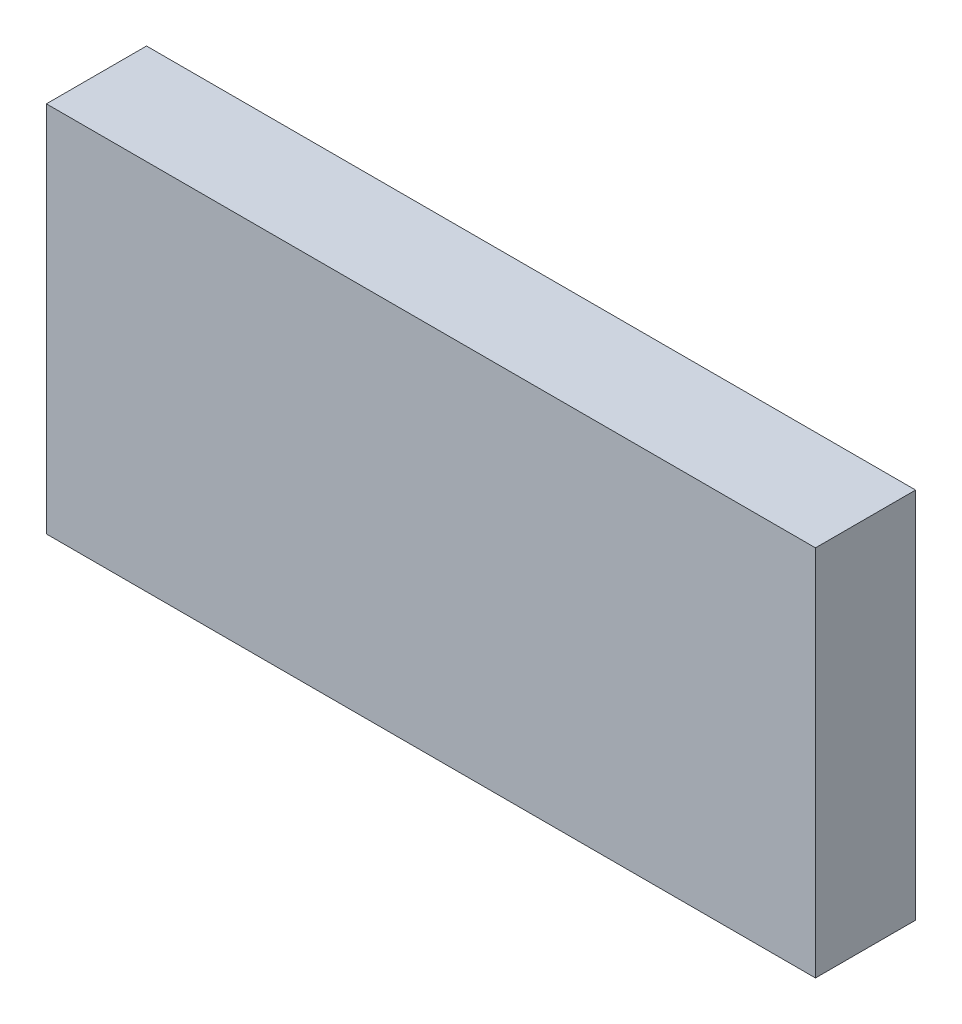
ISO-10303-21;
HEADER;
FILE_DESCRIPTION(('STEP AP214'),'2;1');
FILE_NAME('part.step','',(''),(''),'','','');
FILE_SCHEMA(('AUTOMOTIVE_DESIGN { 1 0 10303 214 1 1 1 1 }'));
ENDSEC;
DATA;
#1=APPLICATION_CONTEXT('core data for automotive mechanical design processes');
#2=APPLICATION_PROTOCOL_DEFINITION('international standard','automotive_design',2000,#1);
#3=PRODUCT_CONTEXT('',#1,'mechanical');
#4=PRODUCT('Part','Part','',(#3));
#5=PRODUCT_RELATED_PRODUCT_CATEGORY('part','',(#4));
#6=PRODUCT_DEFINITION_FORMATION('','',#4);
#7=PRODUCT_DEFINITION_CONTEXT('part definition',#1,'design');
#8=PRODUCT_DEFINITION('design','',#6,#7);
#9=PRODUCT_DEFINITION_SHAPE('','',#8);
#10=(LENGTH_UNIT() NAMED_UNIT(*) SI_UNIT(.MILLI.,.METRE.));
#11=(NAMED_UNIT(*) PLANE_ANGLE_UNIT() SI_UNIT($,.RADIAN.));
#12=(NAMED_UNIT(*) SI_UNIT($,.STERADIAN.) SOLID_ANGLE_UNIT());
#13=UNCERTAINTY_MEASURE_WITH_UNIT(LENGTH_MEASURE(1.E-05),#10,'distance_accuracy_value','');
#14=(GEOMETRIC_REPRESENTATION_CONTEXT(3) GLOBAL_UNCERTAINTY_ASSIGNED_CONTEXT((#13)) GLOBAL_UNIT_ASSIGNED_CONTEXT((#10,
#11,#12)) REPRESENTATION_CONTEXT('',''));
#15=CARTESIAN_POINT('',(0.,0.,0.));
#16=DIRECTION('',(0.,0.,1.));
#17=DIRECTION('',(1.,0.,0.));
#18=AXIS2_PLACEMENT_3D('',#15,#16,#17);
#19=CARTESIAN_POINT('',(-28.1747899159664,19.6711260504202,6.35));
#20=DIRECTION('',(1.,0.,0.));
#21=DIRECTION('',(0.,0.,-1.));
#22=AXIS2_PLACEMENT_3D('',#19,#20,#21);
#23=PLANE('',#22);
#24=DIRECTION('',(0.,-1.,0.));
#25=VECTOR('',#24,1.);
#26=CARTESIAN_POINT('',(-28.1747899159664,19.6711260504202,0.));
#27=LINE('',#26,#25);
#28=CARTESIAN_POINT('',(-28.1747899159664,19.6711260504202,0.));
#29=VERTEX_POINT('',#28);
#30=CARTESIAN_POINT('',(-28.1747899159664,-3.95087394957983,0.));
#31=VERTEX_POINT('',#30);
#32=EDGE_CURVE('E113',#29,#31,#27,.T.);
#33=ORIENTED_EDGE('',*,*,#32,.T.);
#34=DIRECTION('',(0.,0.,-1.));
#35=VECTOR('',#34,1.);
#36=CARTESIAN_POINT('',(-28.1747899159664,-3.95087394957983,6.35));
#37=LINE('',#36,#35);
#38=CARTESIAN_POINT('',(-28.1747899159664,-3.95087394957983,6.35));
#39=VERTEX_POINT('',#38);
#40=EDGE_CURVE('E11',#39,#31,#37,.T.);
#41=ORIENTED_EDGE('',*,*,#40,.F.);
#42=DIRECTION('',(0.,-1.,0.));
#43=VECTOR('',#42,1.);
#44=CARTESIAN_POINT('',(-28.1747899159664,19.6711260504202,6.35));
#45=LINE('',#44,#43);
#46=CARTESIAN_POINT('',(-28.1747899159664,19.6711260504202,6.35));
#47=VERTEX_POINT('',#46);
#48=EDGE_CURVE('E97',#47,#39,#45,.T.);
#49=ORIENTED_EDGE('',*,*,#48,.F.);
#50=DIRECTION('',(0.,0.,-1.));
#51=VECTOR('',#50,1.);
#52=CARTESIAN_POINT('',(-28.1747899159664,19.6711260504202,6.35));
#53=LINE('',#52,#51);
#54=EDGE_CURVE('E109',#47,#29,#53,.T.);
#55=ORIENTED_EDGE('',*,*,#54,.T.);
#56=EDGE_LOOP('',(#33,#41,#49,#55));
#57=FACE_BOUND('',#56,.T.);
#58=ADVANCED_FACE('F45',(#57),#23,.F.);
#59=CARTESIAN_POINT('',(-28.1747899159664,-3.95087394957983,6.35));
#60=DIRECTION('',(0.,1.,0.));
#61=DIRECTION('',(0.,0.,1.));
#62=AXIS2_PLACEMENT_3D('',#59,#60,#61);
#63=PLANE('',#62);
#64=DIRECTION('',(1.,0.,0.));
#65=VECTOR('',#64,1.);
#66=CARTESIAN_POINT('',(-28.1747899159664,-3.95087394957983,0.));
#67=LINE('',#66,#65);
#68=CARTESIAN_POINT('',(20.5932100840336,-3.95087394957983,0.));
#69=VERTEX_POINT('',#68);
#70=EDGE_CURVE('E102',#31,#69,#67,.T.);
#71=ORIENTED_EDGE('',*,*,#70,.T.);
#72=DIRECTION('',(0.,0.,-1.));
#73=VECTOR('',#72,1.);
#74=CARTESIAN_POINT('',(20.5932100840336,-3.95087394957983,6.35));
#75=LINE('',#74,#73);
#76=CARTESIAN_POINT('',(20.5932100840336,-3.95087394957983,6.35));
#77=VERTEX_POINT('',#76);
#78=EDGE_CURVE('E54',#77,#69,#75,.T.);
#79=ORIENTED_EDGE('',*,*,#78,.F.);
#80=DIRECTION('',(1.,0.,0.));
#81=VECTOR('',#80,1.);
#82=CARTESIAN_POINT('',(-28.1747899159664,-3.95087394957983,6.35));
#83=LINE('',#82,#81);
#84=EDGE_CURVE('E92',#39,#77,#83,.T.);
#85=ORIENTED_EDGE('',*,*,#84,.F.);
#86=ORIENTED_EDGE('',*,*,#40,.T.);
#87=EDGE_LOOP('',(#71,#79,#85,#86));
#88=FACE_BOUND('',#87,.T.);
#89=ADVANCED_FACE('F101',(#88),#63,.F.);
#90=CARTESIAN_POINT('',(20.5932100840336,19.6711260504202,6.35));
#91=DIRECTION('',(-1.,0.,0.));
#92=DIRECTION('',(0.,-1.,0.));
#93=AXIS2_PLACEMENT_3D('',#90,#91,#92);
#94=PLANE('',#93);
#95=DIRECTION('',(0.,1.,0.));
#96=VECTOR('',#95,1.);
#97=CARTESIAN_POINT('',(20.5932100840336,19.6711260504202,0.));
#98=LINE('',#97,#96);
#99=CARTESIAN_POINT('',(20.5932100840336,19.6711260504202,0.));
#100=VERTEX_POINT('',#99);
#101=EDGE_CURVE('E79',#69,#100,#98,.T.);
#102=ORIENTED_EDGE('',*,*,#101,.T.);
#103=DIRECTION('',(0.,0.,-1.));
#104=VECTOR('',#103,1.);
#105=CARTESIAN_POINT('',(20.5932100840336,19.6711260504202,6.35));
#106=LINE('',#105,#104);
#107=CARTESIAN_POINT('',(20.5932100840336,19.6711260504202,6.35));
#108=VERTEX_POINT('',#107);
#109=EDGE_CURVE('E104',#108,#100,#106,.T.);
#110=ORIENTED_EDGE('',*,*,#109,.F.);
#111=DIRECTION('',(0.,1.,0.));
#112=VECTOR('',#111,1.);
#113=CARTESIAN_POINT('',(20.5932100840336,19.6711260504202,6.35));
#114=LINE('',#113,#112);
#115=EDGE_CURVE('E95',#77,#108,#114,.T.);
#116=ORIENTED_EDGE('',*,*,#115,.F.);
#117=ORIENTED_EDGE('',*,*,#78,.T.);
#118=EDGE_LOOP('',(#102,#110,#116,#117));
#119=FACE_BOUND('',#118,.T.);
#120=ADVANCED_FACE('F105',(#119),#94,.F.);
#121=CARTESIAN_POINT('',(-28.1747899159664,19.6711260504202,6.35));
#122=DIRECTION('',(0.,-1.,0.));
#123=DIRECTION('',(0.,0.,-1.));
#124=AXIS2_PLACEMENT_3D('',#121,#122,#123);
#125=PLANE('',#124);
#126=DIRECTION('',(-1.,0.,0.));
#127=VECTOR('',#126,1.);
#128=CARTESIAN_POINT('',(-28.1747899159664,19.6711260504202,0.));
#129=LINE('',#128,#127);
#130=EDGE_CURVE('E85',#100,#29,#129,.T.);
#131=ORIENTED_EDGE('',*,*,#130,.T.);
#132=ORIENTED_EDGE('',*,*,#54,.F.);
#133=DIRECTION('',(-1.,0.,0.));
#134=VECTOR('',#133,1.);
#135=CARTESIAN_POINT('',(-28.1747899159664,19.6711260504202,6.35));
#136=LINE('',#135,#134);
#137=EDGE_CURVE('E62',#108,#47,#136,.T.);
#138=ORIENTED_EDGE('',*,*,#137,.F.);
#139=ORIENTED_EDGE('',*,*,#109,.T.);
#140=EDGE_LOOP('',(#131,#132,#138,#139));
#141=FACE_BOUND('',#140,.T.);
#142=ADVANCED_FACE('F126',(#141),#125,.F.);
#143=CARTESIAN_POINT('',(0.,0.,6.35));
#144=DIRECTION('',(0.,0.,1.));
#145=DIRECTION('',(1.,0.,0.));
#146=AXIS2_PLACEMENT_3D('',#143,#144,#145);
#147=PLANE('',#146);
#148=ORIENTED_EDGE('',*,*,#48,.T.);
#149=ORIENTED_EDGE('',*,*,#84,.T.);
#150=ORIENTED_EDGE('',*,*,#115,.T.);
#151=ORIENTED_EDGE('',*,*,#137,.T.);
#152=EDGE_LOOP('',(#148,#149,#150,#151));
#153=FACE_BOUND('',#152,.T.);
#154=ADVANCED_FACE('F93',(#153),#147,.T.);
#155=CARTESIAN_POINT('',(0.,0.,0.));
#156=DIRECTION('',(0.,0.,1.));
#157=DIRECTION('',(1.,0.,0.));
#158=AXIS2_PLACEMENT_3D('',#155,#156,#157);
#159=PLANE('',#158);
#160=ORIENTED_EDGE('',*,*,#32,.F.);
#161=ORIENTED_EDGE('',*,*,#130,.F.);
#162=ORIENTED_EDGE('',*,*,#101,.F.);
#163=ORIENTED_EDGE('',*,*,#70,.F.);
#164=EDGE_LOOP('',(#160,#161,#162,#163));
#165=FACE_BOUND('',#164,.T.);
#166=ADVANCED_FACE('F129',(#165),#159,.F.);
#167=CLOSED_SHELL('',(#58,#89,#120,#142,#154,#166));
#168=MANIFOLD_SOLID_BREP('B2',#167);
#169=ADVANCED_BREP_SHAPE_REPRESENTATION('',(#18,#168),#14);
#170=SHAPE_DEFINITION_REPRESENTATION(#9,#169);
ENDSEC;
END-ISO-10303-21;
